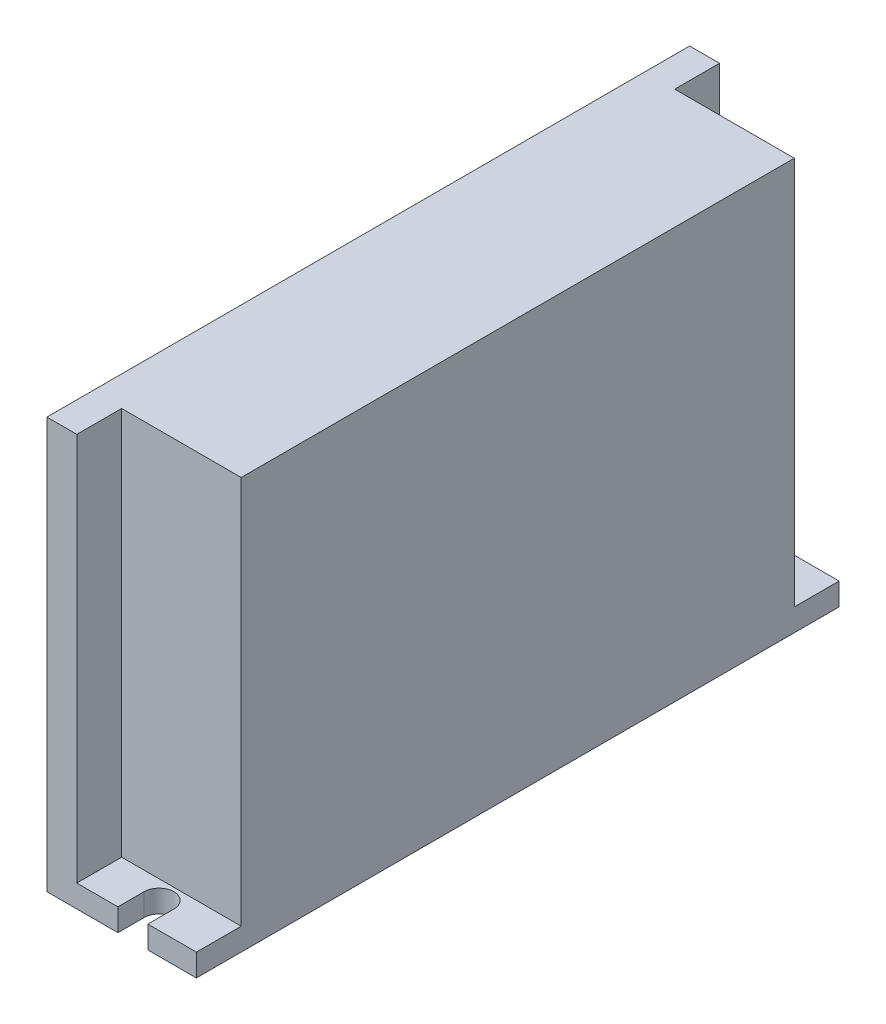
ISO-10303-21;
HEADER;
FILE_DESCRIPTION(('STEP AP214'),'2;1');
FILE_NAME('part.step','',(''),(''),'','','');
FILE_SCHEMA(('AUTOMOTIVE_DESIGN { 1 0 10303 214 1 1 1 1 }'));
ENDSEC;
DATA;
#1=APPLICATION_CONTEXT('core data for automotive mechanical design processes');
#2=APPLICATION_PROTOCOL_DEFINITION('international standard','automotive_design',2000,#1);
#3=PRODUCT_CONTEXT('',#1,'mechanical');
#4=PRODUCT('Part','Part','',(#3));
#5=PRODUCT_RELATED_PRODUCT_CATEGORY('part','',(#4));
#6=PRODUCT_DEFINITION_FORMATION('','',#4);
#7=PRODUCT_DEFINITION_CONTEXT('part definition',#1,'design');
#8=PRODUCT_DEFINITION('design','',#6,#7);
#9=PRODUCT_DEFINITION_SHAPE('','',#8);
#10=(LENGTH_UNIT() NAMED_UNIT(*) SI_UNIT(.MILLI.,.METRE.));
#11=(NAMED_UNIT(*) PLANE_ANGLE_UNIT() SI_UNIT($,.RADIAN.));
#12=(NAMED_UNIT(*) SI_UNIT($,.STERADIAN.) SOLID_ANGLE_UNIT());
#13=UNCERTAINTY_MEASURE_WITH_UNIT(LENGTH_MEASURE(1.E-05),#10,'distance_accuracy_value','');
#14=(GEOMETRIC_REPRESENTATION_CONTEXT(3) GLOBAL_UNCERTAINTY_ASSIGNED_CONTEXT((#13)) GLOBAL_UNIT_ASSIGNED_CONTEXT((#10,
#11,#12)) REPRESENTATION_CONTEXT('',''));
#15=CARTESIAN_POINT('',(0.,0.,0.));
#16=DIRECTION('',(0.,0.,1.));
#17=DIRECTION('',(1.,0.,0.));
#18=AXIS2_PLACEMENT_3D('',#15,#16,#17);
#19=CARTESIAN_POINT('',(0.,3.,0.));
#20=DIRECTION('',(0.,-1.,0.));
#21=DIRECTION('',(0.,0.,-1.));
#22=AXIS2_PLACEMENT_3D('',#19,#20,#21);
#23=PLANE('',#22);
#24=DIRECTION('',(-1.,0.,0.));
#25=VECTOR('',#24,1.);
#26=CARTESIAN_POINT('',(10.,3.,-37.));
#27=LINE('',#26,#25);
#28=CARTESIAN_POINT('',(10.,3.,-37.));
#29=VERTEX_POINT('',#28);
#30=CARTESIAN_POINT('',(-5.99999999999999,3.,-37.));
#31=VERTEX_POINT('',#30);
#32=EDGE_CURVE('E381',#29,#31,#27,.T.);
#33=ORIENTED_EDGE('',*,*,#32,.F.);
#34=DIRECTION('',(0.,0.,-1.));
#35=VECTOR('',#34,1.);
#36=CARTESIAN_POINT('',(10.,3.,43.));
#37=LINE('',#36,#35);
#38=CARTESIAN_POINT('',(10.,3.,-43.));
#39=VERTEX_POINT('',#38);
#40=EDGE_CURVE('E191',#29,#39,#37,.T.);
#41=ORIENTED_EDGE('',*,*,#40,.T.);
#42=DIRECTION('',(-1.,0.,0.));
#43=VECTOR('',#42,1.);
#44=CARTESIAN_POINT('',(-10.,3.,-43.));
#45=LINE('',#44,#43);
#46=CARTESIAN_POINT('',(3.49999999999999,3.,-43.));
#47=VERTEX_POINT('',#46);
#48=EDGE_CURVE('E304',#39,#47,#45,.T.);
#49=ORIENTED_EDGE('',*,*,#48,.T.);
#50=DIRECTION('',(0.,0.,-1.));
#51=VECTOR('',#50,1.);
#52=CARTESIAN_POINT('',(3.49999999999999,3.,-39.5));
#53=LINE('',#52,#51);
#54=CARTESIAN_POINT('',(3.49999999999999,3.,-39.5));
#55=VERTEX_POINT('',#54);
#56=EDGE_CURVE('E282',#55,#47,#53,.T.);
#57=ORIENTED_EDGE('',*,*,#56,.F.);
#58=CARTESIAN_POINT('',(1.49999999999999,3.,-39.5));
#59=DIRECTION('',(0.,1.,0.));
#60=DIRECTION('',(0.,0.,1.));
#61=AXIS2_PLACEMENT_3D('',#58,#59,#60);
#62=CIRCLE('',#61,2.);
#63=CARTESIAN_POINT('',(-0.50000000000001,3.,-39.5));
#64=VERTEX_POINT('',#63);
#65=EDGE_CURVE('E245',#64,#55,#62,.T.);
#66=ORIENTED_EDGE('',*,*,#65,.F.);
#67=DIRECTION('',(0.,0.,1.));
#68=VECTOR('',#67,1.);
#69=CARTESIAN_POINT('',(-0.50000000000001,3.,-39.5));
#70=LINE('',#69,#68);
#71=CARTESIAN_POINT('',(-0.500000000000021,3.,-43.));
#72=VERTEX_POINT('',#71);
#73=EDGE_CURVE('E278',#72,#64,#70,.T.);
#74=ORIENTED_EDGE('',*,*,#73,.F.);
#75=CARTESIAN_POINT('',(-6.,3.,-43.));
#76=VERTEX_POINT('',#75);
#77=EDGE_CURVE('E303',#72,#76,#45,.T.);
#78=ORIENTED_EDGE('',*,*,#77,.T.);
#79=DIRECTION('',(0.,0.,-1.));
#80=VECTOR('',#79,1.);
#81=CARTESIAN_POINT('',(-6.,3.,-43.));
#82=LINE('',#81,#80);
#83=EDGE_CURVE('E193',#31,#76,#82,.T.);
#84=ORIENTED_EDGE('',*,*,#83,.F.);
#85=EDGE_LOOP('',(#33,#41,#49,#57,#66,#74,#78,#84));
#86=FACE_BOUND('',#85,.T.);
#87=ADVANCED_FACE('F42',(#86),#23,.F.);
#88=DIRECTION('',(1.,0.,0.));
#89=VECTOR('',#88,1.);
#90=CARTESIAN_POINT('',(10.,3.,37.));
#91=LINE('',#90,#89);
#92=CARTESIAN_POINT('',(-5.99999999999999,3.,37.));
#93=VERTEX_POINT('',#92);
#94=CARTESIAN_POINT('',(10.,3.,37.));
#95=VERTEX_POINT('',#94);
#96=EDGE_CURVE('E186',#93,#95,#91,.T.);
#97=ORIENTED_EDGE('',*,*,#96,.F.);
#98=CARTESIAN_POINT('',(-5.99999999999999,3.,43.));
#99=VERTEX_POINT('',#98);
#100=EDGE_CURVE('E66',#99,#93,#82,.T.);
#101=ORIENTED_EDGE('',*,*,#100,.F.);
#102=DIRECTION('',(1.,0.,0.));
#103=VECTOR('',#102,1.);
#104=CARTESIAN_POINT('',(-10.,3.,43.));
#105=LINE('',#104,#103);
#106=CARTESIAN_POINT('',(-0.500000000000011,3.,43.));
#107=VERTEX_POINT('',#106);
#108=EDGE_CURVE('E309',#99,#107,#105,.T.);
#109=ORIENTED_EDGE('',*,*,#108,.T.);
#110=DIRECTION('',(0.,0.,1.));
#111=VECTOR('',#110,1.);
#112=CARTESIAN_POINT('',(-0.5,3.,39.5));
#113=LINE('',#112,#111);
#114=CARTESIAN_POINT('',(-0.5,3.,39.5));
#115=VERTEX_POINT('',#114);
#116=EDGE_CURVE('E244',#115,#107,#113,.T.);
#117=ORIENTED_EDGE('',*,*,#116,.F.);
#118=CARTESIAN_POINT('',(1.5,3.,39.5));
#119=DIRECTION('',(0.,1.,0.));
#120=DIRECTION('',(0.,0.,1.));
#121=AXIS2_PLACEMENT_3D('',#118,#119,#120);
#122=CIRCLE('',#121,2.);
#123=CARTESIAN_POINT('',(3.5,3.,39.5));
#124=VERTEX_POINT('',#123);
#125=EDGE_CURVE('E240',#124,#115,#122,.T.);
#126=ORIENTED_EDGE('',*,*,#125,.F.);
#127=DIRECTION('',(0.,0.,-1.));
#128=VECTOR('',#127,1.);
#129=CARTESIAN_POINT('',(3.5,3.,39.5));
#130=LINE('',#129,#128);
#131=CARTESIAN_POINT('',(3.5,3.,43.));
#132=VERTEX_POINT('',#131);
#133=EDGE_CURVE('E231',#132,#124,#130,.T.);
#134=ORIENTED_EDGE('',*,*,#133,.F.);
#135=CARTESIAN_POINT('',(10.,3.,43.));
#136=VERTEX_POINT('',#135);
#137=EDGE_CURVE('E308',#132,#136,#105,.T.);
#138=ORIENTED_EDGE('',*,*,#137,.T.);
#139=EDGE_CURVE('E299',#136,#95,#37,.T.);
#140=ORIENTED_EDGE('',*,*,#139,.T.);
#141=EDGE_LOOP('',(#97,#101,#109,#117,#126,#134,#138,#140));
#142=FACE_BOUND('',#141,.T.);
#143=ADVANCED_FACE('F395',(#142),#23,.F.);
#144=CARTESIAN_POINT('',(-6.,55.,-43.));
#145=DIRECTION('',(-1.,0.,0.));
#146=DIRECTION('',(0.,0.,1.));
#147=AXIS2_PLACEMENT_3D('',#144,#145,#146);
#148=PLANE('',#147);
#149=DIRECTION('',(0.,-1.,0.));
#150=VECTOR('',#149,1.);
#151=CARTESIAN_POINT('',(-5.99999999999999,55.,-37.));
#152=LINE('',#151,#150);
#153=CARTESIAN_POINT('',(-6.,55.,-37.));
#154=VERTEX_POINT('',#153);
#155=EDGE_CURVE('E58',#154,#31,#152,.T.);
#156=ORIENTED_EDGE('',*,*,#155,.T.);
#157=ORIENTED_EDGE('',*,*,#83,.T.);
#158=DIRECTION('',(0.,-1.,0.));
#159=VECTOR('',#158,1.);
#160=CARTESIAN_POINT('',(-6.,55.,-43.));
#161=LINE('',#160,#159);
#162=CARTESIAN_POINT('',(-6.,55.,-43.));
#163=VERTEX_POINT('',#162);
#164=EDGE_CURVE('E215',#163,#76,#161,.T.);
#165=ORIENTED_EDGE('',*,*,#164,.F.);
#166=DIRECTION('',(0.,0.,-1.));
#167=VECTOR('',#166,1.);
#168=CARTESIAN_POINT('',(-6.,55.,-43.));
#169=LINE('',#168,#167);
#170=EDGE_CURVE('E208',#154,#163,#169,.T.);
#171=ORIENTED_EDGE('',*,*,#170,.F.);
#172=EDGE_LOOP('',(#156,#157,#165,#171));
#173=FACE_BOUND('',#172,.T.);
#174=ADVANCED_FACE('F358',(#173),#148,.F.);
#175=DIRECTION('',(0.,-1.,0.));
#176=VECTOR('',#175,1.);
#177=CARTESIAN_POINT('',(-5.99999999999999,55.,37.));
#178=LINE('',#177,#176);
#179=CARTESIAN_POINT('',(-5.99999999999999,55.,37.));
#180=VERTEX_POINT('',#179);
#181=EDGE_CURVE('E198',#180,#93,#178,.T.);
#182=ORIENTED_EDGE('',*,*,#181,.F.);
#183=CARTESIAN_POINT('',(-5.99999999999999,55.,43.));
#184=VERTEX_POINT('',#183);
#185=EDGE_CURVE('E209',#184,#180,#169,.T.);
#186=ORIENTED_EDGE('',*,*,#185,.F.);
#187=DIRECTION('',(0.,-1.,0.));
#188=VECTOR('',#187,1.);
#189=CARTESIAN_POINT('',(-5.99999999999999,55.,43.));
#190=LINE('',#189,#188);
#191=EDGE_CURVE('E221',#184,#99,#190,.T.);
#192=ORIENTED_EDGE('',*,*,#191,.T.);
#193=ORIENTED_EDGE('',*,*,#100,.T.);
#194=EDGE_LOOP('',(#182,#186,#192,#193));
#195=FACE_BOUND('',#194,.T.);
#196=ADVANCED_FACE('F397',(#195),#148,.F.);
#197=CARTESIAN_POINT('',(-10.,3.,-43.));
#198=DIRECTION('',(0.,0.,1.));
#199=DIRECTION('',(1.,0.,0.));
#200=AXIS2_PLACEMENT_3D('',#197,#198,#199);
#201=PLANE('',#200);
#202=ORIENTED_EDGE('',*,*,#77,.F.);
#203=DIRECTION('',(0.,1.,0.));
#204=VECTOR('',#203,1.);
#205=CARTESIAN_POINT('',(-0.500000000000021,0.,-43.));
#206=LINE('',#205,#204);
#207=CARTESIAN_POINT('',(-0.500000000000021,0.,-43.));
#208=VERTEX_POINT('',#207);
#209=EDGE_CURVE('E273',#208,#72,#206,.T.);
#210=ORIENTED_EDGE('',*,*,#209,.F.);
#211=DIRECTION('',(-1.,0.,0.));
#212=VECTOR('',#211,1.);
#213=CARTESIAN_POINT('',(-10.,0.,-43.));
#214=LINE('',#213,#212);
#215=CARTESIAN_POINT('',(-10.,0.,-43.));
#216=VERTEX_POINT('',#215);
#217=EDGE_CURVE('E315',#208,#216,#214,.T.);
#218=ORIENTED_EDGE('',*,*,#217,.T.);
#219=DIRECTION('',(0.,-1.,0.));
#220=VECTOR('',#219,1.);
#221=CARTESIAN_POINT('',(-10.,3.,-43.));
#222=LINE('',#221,#220);
#223=CARTESIAN_POINT('',(-10.,55.,-43.));
#224=VERTEX_POINT('',#223);
#225=EDGE_CURVE('E51',#224,#216,#222,.T.);
#226=ORIENTED_EDGE('',*,*,#225,.F.);
#227=DIRECTION('',(-1.,0.,0.));
#228=VECTOR('',#227,1.);
#229=CARTESIAN_POINT('',(-10.,55.,-43.));
#230=LINE('',#229,#228);
#231=EDGE_CURVE('E212',#163,#224,#230,.T.);
#232=ORIENTED_EDGE('',*,*,#231,.F.);
#233=ORIENTED_EDGE('',*,*,#164,.T.);
#234=EDGE_LOOP('',(#202,#210,#218,#226,#232,#233));
#235=FACE_BOUND('',#234,.T.);
#236=ADVANCED_FACE('F354',(#235),#201,.F.);
#237=CARTESIAN_POINT('',(-10.,3.,43.));
#238=DIRECTION('',(0.,0.,-1.));
#239=DIRECTION('',(-1.,0.,0.));
#240=AXIS2_PLACEMENT_3D('',#237,#238,#239);
#241=PLANE('',#240);
#242=ORIENTED_EDGE('',*,*,#137,.F.);
#243=DIRECTION('',(0.,1.,0.));
#244=VECTOR('',#243,1.);
#245=CARTESIAN_POINT('',(3.5,0.,43.));
#246=LINE('',#245,#244);
#247=CARTESIAN_POINT('',(3.5,0.,43.));
#248=VERTEX_POINT('',#247);
#249=EDGE_CURVE('E256',#248,#132,#246,.T.);
#250=ORIENTED_EDGE('',*,*,#249,.F.);
#251=DIRECTION('',(1.,0.,0.));
#252=VECTOR('',#251,1.);
#253=CARTESIAN_POINT('',(-10.,0.,43.));
#254=LINE('',#253,#252);
#255=CARTESIAN_POINT('',(10.,0.,43.));
#256=VERTEX_POINT('',#255);
#257=EDGE_CURVE('E323',#248,#256,#254,.T.);
#258=ORIENTED_EDGE('',*,*,#257,.T.);
#259=DIRECTION('',(0.,-1.,0.));
#260=VECTOR('',#259,1.);
#261=CARTESIAN_POINT('',(10.,3.,43.));
#262=LINE('',#261,#260);
#263=EDGE_CURVE('E312',#136,#256,#262,.T.);
#264=ORIENTED_EDGE('',*,*,#263,.F.);
#265=EDGE_LOOP('',(#242,#250,#258,#264));
#266=FACE_BOUND('',#265,.T.);
#267=ADVANCED_FACE('F404',(#266),#241,.F.);
#268=CARTESIAN_POINT('',(10.,3.,43.));
#269=DIRECTION('',(-1.,0.,0.));
#270=DIRECTION('',(0.,0.,1.));
#271=AXIS2_PLACEMENT_3D('',#268,#269,#270);
#272=PLANE('',#271);
#273=DIRECTION('',(0.,0.,-1.));
#274=VECTOR('',#273,1.);
#275=CARTESIAN_POINT('',(10.,0.,43.));
#276=LINE('',#275,#274);
#277=CARTESIAN_POINT('',(10.,0.,-43.));
#278=VERTEX_POINT('',#277);
#279=EDGE_CURVE('E255',#256,#278,#276,.T.);
#280=ORIENTED_EDGE('',*,*,#279,.T.);
#281=DIRECTION('',(0.,-1.,0.));
#282=VECTOR('',#281,1.);
#283=CARTESIAN_POINT('',(10.,3.,-43.));
#284=LINE('',#283,#282);
#285=EDGE_CURVE('E11',#39,#278,#284,.T.);
#286=ORIENTED_EDGE('',*,*,#285,.F.);
#287=ORIENTED_EDGE('',*,*,#40,.F.);
#288=DIRECTION('',(0.,-1.,0.));
#289=VECTOR('',#288,1.);
#290=CARTESIAN_POINT('',(10.,55.,-37.));
#291=LINE('',#290,#289);
#292=CARTESIAN_POINT('',(10.,55.,-37.));
#293=VERTEX_POINT('',#292);
#294=EDGE_CURVE('E170',#293,#29,#291,.T.);
#295=ORIENTED_EDGE('',*,*,#294,.F.);
#296=DIRECTION('',(0.,0.,-1.));
#297=VECTOR('',#296,1.);
#298=CARTESIAN_POINT('',(10.,55.,-37.));
#299=LINE('',#298,#297);
#300=CARTESIAN_POINT('',(10.,55.,37.));
#301=VERTEX_POINT('',#300);
#302=EDGE_CURVE('E176',#301,#293,#299,.T.);
#303=ORIENTED_EDGE('',*,*,#302,.F.);
#304=DIRECTION('',(0.,-1.,0.));
#305=VECTOR('',#304,1.);
#306=CARTESIAN_POINT('',(10.,55.,37.));
#307=LINE('',#306,#305);
#308=EDGE_CURVE('E388',#301,#95,#307,.T.);
#309=ORIENTED_EDGE('',*,*,#308,.T.);
#310=ORIENTED_EDGE('',*,*,#139,.F.);
#311=ORIENTED_EDGE('',*,*,#263,.T.);
#312=EDGE_LOOP('',(#280,#286,#287,#295,#303,#309,#310,#311));
#313=FACE_BOUND('',#312,.T.);
#314=ADVANCED_FACE('F44',(#313),#272,.F.);
#315=CARTESIAN_POINT('',(3.49999999999999,0.,-43.));
#316=VERTEX_POINT('',#315);
#317=EDGE_CURVE('E316',#278,#316,#214,.T.);
#318=ORIENTED_EDGE('',*,*,#317,.T.);
#319=DIRECTION('',(0.,1.,0.));
#320=VECTOR('',#319,1.);
#321=CARTESIAN_POINT('',(3.49999999999999,0.,-43.));
#322=LINE('',#321,#320);
#323=EDGE_CURVE('E269',#316,#47,#322,.T.);
#324=ORIENTED_EDGE('',*,*,#323,.T.);
#325=ORIENTED_EDGE('',*,*,#48,.F.);
#326=ORIENTED_EDGE('',*,*,#285,.T.);
#327=EDGE_LOOP('',(#318,#324,#325,#326));
#328=FACE_BOUND('',#327,.T.);
#329=ADVANCED_FACE('F380',(#328),#201,.F.);
#330=CARTESIAN_POINT('',(-10.,3.,43.));
#331=DIRECTION('',(1.,0.,0.));
#332=DIRECTION('',(0.,0.,-1.));
#333=AXIS2_PLACEMENT_3D('',#330,#331,#332);
#334=PLANE('',#333);
#335=DIRECTION('',(0.,0.,1.));
#336=VECTOR('',#335,1.);
#337=CARTESIAN_POINT('',(-10.,0.,43.));
#338=LINE('',#337,#336);
#339=CARTESIAN_POINT('',(-10.,0.,43.));
#340=VERTEX_POINT('',#339);
#341=EDGE_CURVE('E320',#216,#340,#338,.T.);
#342=ORIENTED_EDGE('',*,*,#341,.T.);
#343=DIRECTION('',(0.,-1.,0.));
#344=VECTOR('',#343,1.);
#345=CARTESIAN_POINT('',(-10.,3.,43.));
#346=LINE('',#345,#344);
#347=CARTESIAN_POINT('',(-10.,55.,43.));
#348=VERTEX_POINT('',#347);
#349=EDGE_CURVE('E331',#348,#340,#346,.T.);
#350=ORIENTED_EDGE('',*,*,#349,.F.);
#351=DIRECTION('',(0.,0.,1.));
#352=VECTOR('',#351,1.);
#353=CARTESIAN_POINT('',(-10.,55.,-43.));
#354=LINE('',#353,#352);
#355=EDGE_CURVE('E202',#224,#348,#354,.T.);
#356=ORIENTED_EDGE('',*,*,#355,.F.);
#357=ORIENTED_EDGE('',*,*,#225,.T.);
#358=EDGE_LOOP('',(#342,#350,#356,#357));
#359=FACE_BOUND('',#358,.T.);
#360=ADVANCED_FACE('F339',(#359),#334,.F.);
#361=CARTESIAN_POINT('',(-0.500000000000006,0.,43.));
#362=VERTEX_POINT('',#361);
#363=EDGE_CURVE('E324',#340,#362,#254,.T.);
#364=ORIENTED_EDGE('',*,*,#363,.T.);
#365=DIRECTION('',(0.,1.,0.));
#366=VECTOR('',#365,1.);
#367=CARTESIAN_POINT('',(-0.500000000000011,0.,43.));
#368=LINE('',#367,#366);
#369=EDGE_CURVE('E259',#362,#107,#368,.T.);
#370=ORIENTED_EDGE('',*,*,#369,.T.);
#371=ORIENTED_EDGE('',*,*,#108,.F.);
#372=ORIENTED_EDGE('',*,*,#191,.F.);
#373=DIRECTION('',(1.,0.,0.));
#374=VECTOR('',#373,1.);
#375=CARTESIAN_POINT('',(-10.,55.,43.));
#376=LINE('',#375,#374);
#377=EDGE_CURVE('E205',#348,#184,#376,.T.);
#378=ORIENTED_EDGE('',*,*,#377,.F.);
#379=ORIENTED_EDGE('',*,*,#349,.T.);
#380=EDGE_LOOP('',(#364,#370,#371,#372,#378,#379));
#381=FACE_BOUND('',#380,.T.);
#382=ADVANCED_FACE('F348',(#381),#241,.F.);
#383=CARTESIAN_POINT('',(0.,0.,0.));
#384=DIRECTION('',(0.,-1.,0.));
#385=DIRECTION('',(0.,0.,-1.));
#386=AXIS2_PLACEMENT_3D('',#383,#384,#385);
#387=PLANE('',#386);
#388=DIRECTION('',(0.,0.,-1.));
#389=VECTOR('',#388,1.);
#390=CARTESIAN_POINT('',(3.5,0.,39.5));
#391=LINE('',#390,#389);
#392=CARTESIAN_POINT('',(3.5,0.,39.5));
#393=VERTEX_POINT('',#392);
#394=EDGE_CURVE('E235',#248,#393,#391,.T.);
#395=ORIENTED_EDGE('',*,*,#394,.T.);
#396=CARTESIAN_POINT('',(1.5,0.,39.5));
#397=DIRECTION('',(0.,1.,0.));
#398=DIRECTION('',(0.,0.,1.));
#399=AXIS2_PLACEMENT_3D('',#396,#397,#398);
#400=CIRCLE('',#399,2.);
#401=CARTESIAN_POINT('',(-0.5,0.,39.5));
#402=VERTEX_POINT('',#401);
#403=EDGE_CURVE('E226',#393,#402,#400,.T.);
#404=ORIENTED_EDGE('',*,*,#403,.T.);
#405=DIRECTION('',(0.,0.,1.));
#406=VECTOR('',#405,1.);
#407=CARTESIAN_POINT('',(-0.5,0.,39.5));
#408=LINE('',#407,#406);
#409=EDGE_CURVE('E230',#402,#362,#408,.T.);
#410=ORIENTED_EDGE('',*,*,#409,.T.);
#411=ORIENTED_EDGE('',*,*,#363,.F.);
#412=ORIENTED_EDGE('',*,*,#341,.F.);
#413=ORIENTED_EDGE('',*,*,#217,.F.);
#414=DIRECTION('',(0.,0.,1.));
#415=VECTOR('',#414,1.);
#416=CARTESIAN_POINT('',(-0.50000000000001,0.,-39.5));
#417=LINE('',#416,#415);
#418=CARTESIAN_POINT('',(-0.50000000000001,0.,-39.5));
#419=VERTEX_POINT('',#418);
#420=EDGE_CURVE('E268',#208,#419,#417,.T.);
#421=ORIENTED_EDGE('',*,*,#420,.T.);
#422=CARTESIAN_POINT('',(1.49999999999999,0.,-39.5));
#423=DIRECTION('',(0.,1.,0.));
#424=DIRECTION('',(0.,0.,1.));
#425=AXIS2_PLACEMENT_3D('',#422,#423,#424);
#426=CIRCLE('',#425,2.);
#427=CARTESIAN_POINT('',(3.49999999999999,0.,-39.5));
#428=VERTEX_POINT('',#427);
#429=EDGE_CURVE('E283',#419,#428,#426,.T.);
#430=ORIENTED_EDGE('',*,*,#429,.T.);
#431=DIRECTION('',(0.,0.,-1.));
#432=VECTOR('',#431,1.);
#433=CARTESIAN_POINT('',(3.49999999999999,0.,-39.5));
#434=LINE('',#433,#432);
#435=EDGE_CURVE('E292',#428,#316,#434,.T.);
#436=ORIENTED_EDGE('',*,*,#435,.T.);
#437=ORIENTED_EDGE('',*,*,#317,.F.);
#438=ORIENTED_EDGE('',*,*,#279,.F.);
#439=ORIENTED_EDGE('',*,*,#257,.F.);
#440=EDGE_LOOP('',(#395,#404,#410,#411,#412,#413,#421,#430,#436,#437,#438,#439));
#441=FACE_BOUND('',#440,.T.);
#442=ADVANCED_FACE('F345',(#441),#387,.T.);
#443=CARTESIAN_POINT('',(1.49999999999999,0.,-39.5));
#444=DIRECTION('',(0.,1.,0.));
#445=DIRECTION('',(0.,0.,1.));
#446=AXIS2_PLACEMENT_3D('',#443,#444,#445);
#447=CYLINDRICAL_SURFACE('',#446,2.);
#448=ORIENTED_EDGE('',*,*,#65,.T.);
#449=DIRECTION('',(0.,1.,0.));
#450=VECTOR('',#449,1.);
#451=CARTESIAN_POINT('',(3.49999999999999,0.,-39.5));
#452=LINE('',#451,#450);
#453=EDGE_CURVE('E265',#428,#55,#452,.T.);
#454=ORIENTED_EDGE('',*,*,#453,.F.);
#455=ORIENTED_EDGE('',*,*,#429,.F.);
#456=DIRECTION('',(0.,1.,0.));
#457=VECTOR('',#456,1.);
#458=CARTESIAN_POINT('',(-0.50000000000001,0.,-39.5));
#459=LINE('',#458,#457);
#460=EDGE_CURVE('E225',#419,#64,#459,.T.);
#461=ORIENTED_EDGE('',*,*,#460,.T.);
#462=EDGE_LOOP('',(#448,#454,#455,#461));
#463=FACE_BOUND('',#462,.T.);
#464=ADVANCED_FACE('F374',(#463),#447,.F.);
#465=CARTESIAN_POINT('',(-0.50000000000001,0.,-39.5));
#466=DIRECTION('',(-1.,0.,0.));
#467=DIRECTION('',(0.,0.,1.));
#468=AXIS2_PLACEMENT_3D('',#465,#466,#467);
#469=PLANE('',#468);
#470=ORIENTED_EDGE('',*,*,#73,.T.);
#471=ORIENTED_EDGE('',*,*,#460,.F.);
#472=ORIENTED_EDGE('',*,*,#420,.F.);
#473=ORIENTED_EDGE('',*,*,#209,.T.);
#474=EDGE_LOOP('',(#470,#471,#472,#473));
#475=FACE_BOUND('',#474,.T.);
#476=ADVANCED_FACE('F370',(#475),#469,.F.);
#477=CARTESIAN_POINT('',(3.49999999999999,0.,-39.5));
#478=DIRECTION('',(1.,0.,0.));
#479=DIRECTION('',(0.,0.,-1.));
#480=AXIS2_PLACEMENT_3D('',#477,#478,#479);
#481=PLANE('',#480);
#482=ORIENTED_EDGE('',*,*,#56,.T.);
#483=ORIENTED_EDGE('',*,*,#323,.F.);
#484=ORIENTED_EDGE('',*,*,#435,.F.);
#485=ORIENTED_EDGE('',*,*,#453,.T.);
#486=EDGE_LOOP('',(#482,#483,#484,#485));
#487=FACE_BOUND('',#486,.T.);
#488=ADVANCED_FACE('F377',(#487),#481,.F.);
#489=CARTESIAN_POINT('',(1.5,0.,39.5));
#490=DIRECTION('',(0.,1.,0.));
#491=DIRECTION('',(0.,0.,1.));
#492=AXIS2_PLACEMENT_3D('',#489,#490,#491);
#493=CYLINDRICAL_SURFACE('',#492,2.);
#494=ORIENTED_EDGE('',*,*,#125,.T.);
#495=DIRECTION('',(0.,1.,0.));
#496=VECTOR('',#495,1.);
#497=CARTESIAN_POINT('',(-0.5,0.,39.5));
#498=LINE('',#497,#496);
#499=EDGE_CURVE('E239',#402,#115,#498,.T.);
#500=ORIENTED_EDGE('',*,*,#499,.F.);
#501=ORIENTED_EDGE('',*,*,#403,.F.);
#502=DIRECTION('',(0.,1.,0.));
#503=VECTOR('',#502,1.);
#504=CARTESIAN_POINT('',(3.5,0.,39.5));
#505=LINE('',#504,#503);
#506=EDGE_CURVE('E252',#393,#124,#505,.T.);
#507=ORIENTED_EDGE('',*,*,#506,.T.);
#508=EDGE_LOOP('',(#494,#500,#501,#507));
#509=FACE_BOUND('',#508,.T.);
#510=ADVANCED_FACE('F442',(#509),#493,.F.);
#511=CARTESIAN_POINT('',(3.5,0.,39.5));
#512=DIRECTION('',(1.,0.,0.));
#513=DIRECTION('',(0.,0.,-1.));
#514=AXIS2_PLACEMENT_3D('',#511,#512,#513);
#515=PLANE('',#514);
#516=ORIENTED_EDGE('',*,*,#133,.T.);
#517=ORIENTED_EDGE('',*,*,#506,.F.);
#518=ORIENTED_EDGE('',*,*,#394,.F.);
#519=ORIENTED_EDGE('',*,*,#249,.T.);
#520=EDGE_LOOP('',(#516,#517,#518,#519));
#521=FACE_BOUND('',#520,.T.);
#522=ADVANCED_FACE('F438',(#521),#515,.F.);
#523=CARTESIAN_POINT('',(-0.5,0.,39.5));
#524=DIRECTION('',(-1.,0.,0.));
#525=DIRECTION('',(0.,0.,1.));
#526=AXIS2_PLACEMENT_3D('',#523,#524,#525);
#527=PLANE('',#526);
#528=ORIENTED_EDGE('',*,*,#116,.T.);
#529=ORIENTED_EDGE('',*,*,#369,.F.);
#530=ORIENTED_EDGE('',*,*,#409,.F.);
#531=ORIENTED_EDGE('',*,*,#499,.T.);
#532=EDGE_LOOP('',(#528,#529,#530,#531));
#533=FACE_BOUND('',#532,.T.);
#534=ADVANCED_FACE('F444',(#533),#527,.F.);
#535=CARTESIAN_POINT('',(0.,55.,0.));
#536=DIRECTION('',(0.,1.,0.));
#537=DIRECTION('',(0.,0.,1.));
#538=AXIS2_PLACEMENT_3D('',#535,#536,#537);
#539=PLANE('',#538);
#540=ORIENTED_EDGE('',*,*,#355,.T.);
#541=ORIENTED_EDGE('',*,*,#377,.T.);
#542=ORIENTED_EDGE('',*,*,#185,.T.);
#543=DIRECTION('',(1.,0.,0.));
#544=VECTOR('',#543,1.);
#545=CARTESIAN_POINT('',(10.,55.,37.));
#546=LINE('',#545,#544);
#547=EDGE_CURVE('E175',#180,#301,#546,.T.);
#548=ORIENTED_EDGE('',*,*,#547,.T.);
#549=ORIENTED_EDGE('',*,*,#302,.T.);
#550=DIRECTION('',(-1.,0.,0.));
#551=VECTOR('',#550,1.);
#552=CARTESIAN_POINT('',(10.,55.,-37.));
#553=LINE('',#552,#551);
#554=EDGE_CURVE('E166',#293,#154,#553,.T.);
#555=ORIENTED_EDGE('',*,*,#554,.T.);
#556=ORIENTED_EDGE('',*,*,#170,.T.);
#557=ORIENTED_EDGE('',*,*,#231,.T.);
#558=EDGE_LOOP('',(#540,#541,#542,#548,#549,#555,#556,#557));
#559=FACE_BOUND('',#558,.T.);
#560=ADVANCED_FACE('F180',(#559),#539,.T.);
#561=CARTESIAN_POINT('',(10.,55.,-37.));
#562=DIRECTION('',(0.,0.,1.));
#563=DIRECTION('',(1.,0.,0.));
#564=AXIS2_PLACEMENT_3D('',#561,#562,#563);
#565=PLANE('',#564);
#566=ORIENTED_EDGE('',*,*,#32,.T.);
#567=ORIENTED_EDGE('',*,*,#155,.F.);
#568=ORIENTED_EDGE('',*,*,#554,.F.);
#569=ORIENTED_EDGE('',*,*,#294,.T.);
#570=EDGE_LOOP('',(#566,#567,#568,#569));
#571=FACE_BOUND('',#570,.T.);
#572=ADVANCED_FACE('F168',(#571),#565,.F.);
#573=CARTESIAN_POINT('',(10.,55.,37.));
#574=DIRECTION('',(0.,0.,-1.));
#575=DIRECTION('',(-1.,0.,0.));
#576=AXIS2_PLACEMENT_3D('',#573,#574,#575);
#577=PLANE('',#576);
#578=ORIENTED_EDGE('',*,*,#96,.T.);
#579=ORIENTED_EDGE('',*,*,#308,.F.);
#580=ORIENTED_EDGE('',*,*,#547,.F.);
#581=ORIENTED_EDGE('',*,*,#181,.T.);
#582=EDGE_LOOP('',(#578,#579,#580,#581));
#583=FACE_BOUND('',#582,.T.);
#584=ADVANCED_FACE('F393',(#583),#577,.F.);
#585=CLOSED_SHELL('',(#87,#143,#174,#196,#236,#267,#314,#329,#360,#382,#442,#464,#476,#488,#510,
#522,#534,#560,#572,#584));
#586=MANIFOLD_SOLID_BREP('B2',#585);
#587=ADVANCED_BREP_SHAPE_REPRESENTATION('',(#18,#586),#14);
#588=SHAPE_DEFINITION_REPRESENTATION(#9,#587);
ENDSEC;
END-ISO-10303-21;
